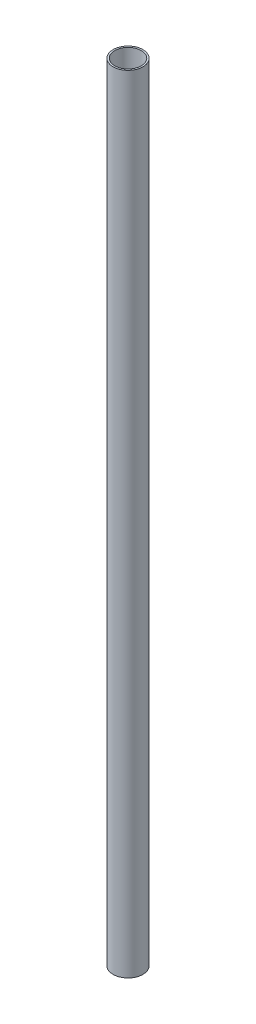
ISO-10303-21;
HEADER;
FILE_DESCRIPTION(('STEP AP214'),'2;1');
FILE_NAME('part.step','',(''),(''),'','','');
FILE_SCHEMA(('AUTOMOTIVE_DESIGN { 1 0 10303 214 1 1 1 1 }'));
ENDSEC;
DATA;
#1=APPLICATION_CONTEXT('core data for automotive mechanical design processes');
#2=APPLICATION_PROTOCOL_DEFINITION('international standard','automotive_design',2000,#1);
#3=PRODUCT_CONTEXT('',#1,'mechanical');
#4=PRODUCT('Part','Part','',(#3));
#5=PRODUCT_RELATED_PRODUCT_CATEGORY('part','',(#4));
#6=PRODUCT_DEFINITION_FORMATION('','',#4);
#7=PRODUCT_DEFINITION_CONTEXT('part definition',#1,'design');
#8=PRODUCT_DEFINITION('design','',#6,#7);
#9=PRODUCT_DEFINITION_SHAPE('','',#8);
#10=(LENGTH_UNIT() NAMED_UNIT(*) SI_UNIT(.MILLI.,.METRE.));
#11=(NAMED_UNIT(*) PLANE_ANGLE_UNIT() SI_UNIT($,.RADIAN.));
#12=(NAMED_UNIT(*) SI_UNIT($,.STERADIAN.) SOLID_ANGLE_UNIT());
#13=UNCERTAINTY_MEASURE_WITH_UNIT(LENGTH_MEASURE(1.E-05),#10,'distance_accuracy_value','');
#14=(GEOMETRIC_REPRESENTATION_CONTEXT(3) GLOBAL_UNCERTAINTY_ASSIGNED_CONTEXT((#13)) GLOBAL_UNIT_ASSIGNED_CONTEXT((#10,
#11,#12)) REPRESENTATION_CONTEXT('',''));
#15=CARTESIAN_POINT('',(0.,0.,0.));
#16=DIRECTION('',(0.,0.,1.));
#17=DIRECTION('',(1.,0.,0.));
#18=AXIS2_PLACEMENT_3D('',#15,#16,#17);
#19=CARTESIAN_POINT('',(0.,0.,0.));
#20=DIRECTION('',(0.,1.,0.));
#21=DIRECTION('',(0.,0.,1.));
#22=AXIS2_PLACEMENT_3D('',#19,#20,#21);
#23=CYLINDRICAL_SURFACE('',#22,16.9418);
#24=CARTESIAN_POINT('',(0.,1003.3,0.));
#25=DIRECTION('',(0.,1.,0.));
#26=DIRECTION('',(0.,0.,1.));
#27=AXIS2_PLACEMENT_3D('',#24,#25,#26);
#28=CIRCLE('',#27,16.9418);
#29=CARTESIAN_POINT('',(0.,1003.3,16.9418));
#30=VERTEX_POINT('',#29);
#31=EDGE_CURVE('E26',#30,#30,#28,.F.);
#32=ORIENTED_EDGE('',*,*,#31,.F.);
#33=EDGE_LOOP('',(#32));
#34=FACE_BOUND('',#33,.T.);
#35=CARTESIAN_POINT('',(0.,0.,0.));
#36=DIRECTION('',(0.,1.,0.));
#37=DIRECTION('',(0.,0.,1.));
#38=AXIS2_PLACEMENT_3D('',#35,#36,#37);
#39=CIRCLE('',#38,16.9418);
#40=CARTESIAN_POINT('',(0.,0.,16.9418));
#41=VERTEX_POINT('',#40);
#42=EDGE_CURVE('E17',#41,#41,#39,.F.);
#43=ORIENTED_EDGE('',*,*,#42,.T.);
#44=EDGE_LOOP('',(#43));
#45=FACE_BOUND('',#44,.T.);
#46=ADVANCED_FACE('F14',(#34,#45),#23,.F.);
#47=CARTESIAN_POINT('',(0.,0.,0.));
#48=DIRECTION('',(0.,1.,0.));
#49=DIRECTION('',(0.,0.,1.));
#50=AXIS2_PLACEMENT_3D('',#47,#48,#49);
#51=PLANE('',#50);
#52=ORIENTED_EDGE('',*,*,#42,.F.);
#53=EDGE_LOOP('',(#52));
#54=FACE_BOUND('',#53,.T.);
#55=CARTESIAN_POINT('',(0.,0.,0.));
#56=DIRECTION('',(0.,1.,0.));
#57=DIRECTION('',(0.,0.,1.));
#58=AXIS2_PLACEMENT_3D('',#55,#56,#57);
#59=CIRCLE('',#58,19.05);
#60=CARTESIAN_POINT('',(0.,0.,19.05));
#61=VERTEX_POINT('',#60);
#62=EDGE_CURVE('E21',#61,#61,#59,.T.);
#63=ORIENTED_EDGE('',*,*,#62,.F.);
#64=EDGE_LOOP('',(#63));
#65=FACE_BOUND('',#64,.T.);
#66=ADVANCED_FACE('F35',(#54,#65),#51,.F.);
#67=CARTESIAN_POINT('',(0.,1003.3,0.));
#68=DIRECTION('',(0.,1.,0.));
#69=DIRECTION('',(0.,0.,1.));
#70=AXIS2_PLACEMENT_3D('',#67,#68,#69);
#71=PLANE('',#70);
#72=ORIENTED_EDGE('',*,*,#31,.T.);
#73=EDGE_LOOP('',(#72));
#74=FACE_BOUND('',#73,.T.);
#75=CARTESIAN_POINT('',(0.,1003.3,0.));
#76=DIRECTION('',(0.,1.,0.));
#77=DIRECTION('',(0.,0.,1.));
#78=AXIS2_PLACEMENT_3D('',#75,#76,#77);
#79=CIRCLE('',#78,19.05);
#80=CARTESIAN_POINT('',(0.,1003.3,19.05));
#81=VERTEX_POINT('',#80);
#82=EDGE_CURVE('E10',#81,#81,#79,.F.);
#83=ORIENTED_EDGE('',*,*,#82,.F.);
#84=EDGE_LOOP('',(#83));
#85=FACE_BOUND('',#84,.T.);
#86=ADVANCED_FACE('F38',(#74,#85),#71,.T.);
#87=CARTESIAN_POINT('',(0.,0.,0.));
#88=DIRECTION('',(0.,1.,0.));
#89=DIRECTION('',(0.,0.,1.));
#90=AXIS2_PLACEMENT_3D('',#87,#88,#89);
#91=CYLINDRICAL_SURFACE('',#90,19.05);
#92=ORIENTED_EDGE('',*,*,#82,.T.);
#93=EDGE_LOOP('',(#92));
#94=FACE_BOUND('',#93,.T.);
#95=ORIENTED_EDGE('',*,*,#62,.T.);
#96=EDGE_LOOP('',(#95));
#97=FACE_BOUND('',#96,.T.);
#98=ADVANCED_FACE('F41',(#94,#97),#91,.T.);
#99=CLOSED_SHELL('',(#46,#66,#86,#98));
#100=MANIFOLD_SOLID_BREP('B1',#99);
#101=ADVANCED_BREP_SHAPE_REPRESENTATION('',(#18,#100),#14);
#102=SHAPE_DEFINITION_REPRESENTATION(#9,#101);
ENDSEC;
END-ISO-10303-21;
